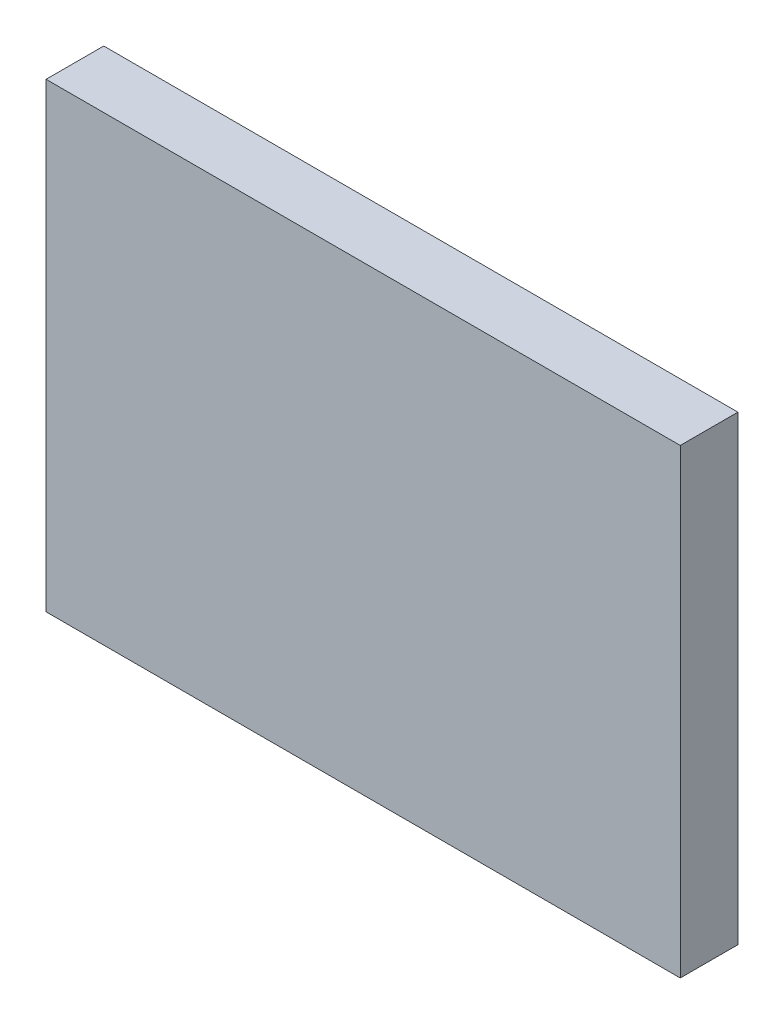
ISO-10303-21;
HEADER;
FILE_DESCRIPTION(('STEP AP214'),'2;1');
FILE_NAME('part.step','',(''),(''),'','','');
FILE_SCHEMA(('AUTOMOTIVE_DESIGN { 1 0 10303 214 1 1 1 1 }'));
ENDSEC;
DATA;
#1=APPLICATION_CONTEXT('core data for automotive mechanical design processes');
#2=APPLICATION_PROTOCOL_DEFINITION('international standard','automotive_design',2000,#1);
#3=PRODUCT_CONTEXT('',#1,'mechanical');
#4=PRODUCT('Part','Part','',(#3));
#5=PRODUCT_RELATED_PRODUCT_CATEGORY('part','',(#4));
#6=PRODUCT_DEFINITION_FORMATION('','',#4);
#7=PRODUCT_DEFINITION_CONTEXT('part definition',#1,'design');
#8=PRODUCT_DEFINITION('design','',#6,#7);
#9=PRODUCT_DEFINITION_SHAPE('','',#8);
#10=(LENGTH_UNIT() NAMED_UNIT(*) SI_UNIT(.MILLI.,.METRE.));
#11=(NAMED_UNIT(*) PLANE_ANGLE_UNIT() SI_UNIT($,.RADIAN.));
#12=(NAMED_UNIT(*) SI_UNIT($,.STERADIAN.) SOLID_ANGLE_UNIT());
#13=UNCERTAINTY_MEASURE_WITH_UNIT(LENGTH_MEASURE(1.E-05),#10,'distance_accuracy_value','');
#14=(GEOMETRIC_REPRESENTATION_CONTEXT(3) GLOBAL_UNCERTAINTY_ASSIGNED_CONTEXT((#13)) GLOBAL_UNIT_ASSIGNED_CONTEXT((#10,
#11,#12)) REPRESENTATION_CONTEXT('',''));
#15=CARTESIAN_POINT('',(0.,0.,0.));
#16=DIRECTION('',(0.,0.,1.));
#17=DIRECTION('',(1.,0.,0.));
#18=AXIS2_PLACEMENT_3D('',#15,#16,#17);
#19=CARTESIAN_POINT('',(0.,0.,6.35));
#20=DIRECTION('',(1.,0.,0.));
#21=DIRECTION('',(0.,0.,-1.));
#22=AXIS2_PLACEMENT_3D('',#19,#20,#21);
#23=PLANE('',#22);
#24=DIRECTION('',(0.,-1.,0.));
#25=VECTOR('',#24,1.);
#26=CARTESIAN_POINT('',(0.,0.,0.));
#27=LINE('',#26,#25);
#28=CARTESIAN_POINT('',(0.,50.8,0.));
#29=VERTEX_POINT('',#28);
#30=CARTESIAN_POINT('',(0.,0.,0.));
#31=VERTEX_POINT('',#30);
#32=EDGE_CURVE('E107',#29,#31,#27,.T.);
#33=ORIENTED_EDGE('',*,*,#32,.T.);
#34=DIRECTION('',(0.,0.,-1.));
#35=VECTOR('',#34,1.);
#36=CARTESIAN_POINT('',(0.,0.,6.35));
#37=LINE('',#36,#35);
#38=CARTESIAN_POINT('',(0.,0.,6.35));
#39=VERTEX_POINT('',#38);
#40=EDGE_CURVE('E11',#39,#31,#37,.T.);
#41=ORIENTED_EDGE('',*,*,#40,.F.);
#42=DIRECTION('',(0.,-1.,0.));
#43=VECTOR('',#42,1.);
#44=CARTESIAN_POINT('',(0.,0.,6.35));
#45=LINE('',#44,#43);
#46=CARTESIAN_POINT('',(0.,50.8,6.35));
#47=VERTEX_POINT('',#46);
#48=EDGE_CURVE('E91',#47,#39,#45,.T.);
#49=ORIENTED_EDGE('',*,*,#48,.F.);
#50=DIRECTION('',(0.,0.,-1.));
#51=VECTOR('',#50,1.);
#52=CARTESIAN_POINT('',(0.,50.8,6.35));
#53=LINE('',#52,#51);
#54=EDGE_CURVE('E103',#47,#29,#53,.T.);
#55=ORIENTED_EDGE('',*,*,#54,.T.);
#56=EDGE_LOOP('',(#33,#41,#49,#55));
#57=FACE_BOUND('',#56,.T.);
#58=ADVANCED_FACE('F39',(#57),#23,.F.);
#59=CARTESIAN_POINT('',(0.,0.,6.35));
#60=DIRECTION('',(0.,1.,0.));
#61=DIRECTION('',(0.,0.,1.));
#62=AXIS2_PLACEMENT_3D('',#59,#60,#61);
#63=PLANE('',#62);
#64=DIRECTION('',(1.,0.,0.));
#65=VECTOR('',#64,1.);
#66=CARTESIAN_POINT('',(0.,0.,0.));
#67=LINE('',#66,#65);
#68=CARTESIAN_POINT('',(69.85,0.,0.));
#69=VERTEX_POINT('',#68);
#70=EDGE_CURVE('E96',#31,#69,#67,.T.);
#71=ORIENTED_EDGE('',*,*,#70,.T.);
#72=DIRECTION('',(0.,0.,-1.));
#73=VECTOR('',#72,1.);
#74=CARTESIAN_POINT('',(69.85,0.,6.35));
#75=LINE('',#74,#73);
#76=CARTESIAN_POINT('',(69.85,0.,6.35));
#77=VERTEX_POINT('',#76);
#78=EDGE_CURVE('E48',#77,#69,#75,.T.);
#79=ORIENTED_EDGE('',*,*,#78,.F.);
#80=DIRECTION('',(1.,0.,0.));
#81=VECTOR('',#80,1.);
#82=CARTESIAN_POINT('',(0.,0.,6.35));
#83=LINE('',#82,#81);
#84=EDGE_CURVE('E86',#39,#77,#83,.T.);
#85=ORIENTED_EDGE('',*,*,#84,.F.);
#86=ORIENTED_EDGE('',*,*,#40,.T.);
#87=EDGE_LOOP('',(#71,#79,#85,#86));
#88=FACE_BOUND('',#87,.T.);
#89=ADVANCED_FACE('F95',(#88),#63,.F.);
#90=CARTESIAN_POINT('',(69.85,0.,6.35));
#91=DIRECTION('',(-1.,0.,0.));
#92=DIRECTION('',(0.,0.,1.));
#93=AXIS2_PLACEMENT_3D('',#90,#91,#92);
#94=PLANE('',#93);
#95=DIRECTION('',(0.,1.,0.));
#96=VECTOR('',#95,1.);
#97=CARTESIAN_POINT('',(69.85,0.,0.));
#98=LINE('',#97,#96);
#99=CARTESIAN_POINT('',(69.85,50.8,0.));
#100=VERTEX_POINT('',#99);
#101=EDGE_CURVE('E73',#69,#100,#98,.T.);
#102=ORIENTED_EDGE('',*,*,#101,.T.);
#103=DIRECTION('',(0.,0.,-1.));
#104=VECTOR('',#103,1.);
#105=CARTESIAN_POINT('',(69.85,50.8,6.35));
#106=LINE('',#105,#104);
#107=CARTESIAN_POINT('',(69.85,50.8,6.35));
#108=VERTEX_POINT('',#107);
#109=EDGE_CURVE('E98',#108,#100,#106,.T.);
#110=ORIENTED_EDGE('',*,*,#109,.F.);
#111=DIRECTION('',(0.,1.,0.));
#112=VECTOR('',#111,1.);
#113=CARTESIAN_POINT('',(69.85,0.,6.35));
#114=LINE('',#113,#112);
#115=EDGE_CURVE('E89',#77,#108,#114,.T.);
#116=ORIENTED_EDGE('',*,*,#115,.F.);
#117=ORIENTED_EDGE('',*,*,#78,.T.);
#118=EDGE_LOOP('',(#102,#110,#116,#117));
#119=FACE_BOUND('',#118,.T.);
#120=ADVANCED_FACE('F99',(#119),#94,.F.);
#121=CARTESIAN_POINT('',(0.,50.8,6.35));
#122=DIRECTION('',(0.,-1.,0.));
#123=DIRECTION('',(0.,0.,-1.));
#124=AXIS2_PLACEMENT_3D('',#121,#122,#123);
#125=PLANE('',#124);
#126=DIRECTION('',(-1.,0.,0.));
#127=VECTOR('',#126,1.);
#128=CARTESIAN_POINT('',(0.,50.8,0.));
#129=LINE('',#128,#127);
#130=EDGE_CURVE('E79',#100,#29,#129,.T.);
#131=ORIENTED_EDGE('',*,*,#130,.T.);
#132=ORIENTED_EDGE('',*,*,#54,.F.);
#133=DIRECTION('',(-1.,0.,0.));
#134=VECTOR('',#133,1.);
#135=CARTESIAN_POINT('',(0.,50.8,6.35));
#136=LINE('',#135,#134);
#137=EDGE_CURVE('E56',#108,#47,#136,.T.);
#138=ORIENTED_EDGE('',*,*,#137,.F.);
#139=ORIENTED_EDGE('',*,*,#109,.T.);
#140=EDGE_LOOP('',(#131,#132,#138,#139));
#141=FACE_BOUND('',#140,.T.);
#142=ADVANCED_FACE('F120',(#141),#125,.F.);
#143=CARTESIAN_POINT('',(0.,0.,6.35));
#144=DIRECTION('',(0.,0.,-1.));
#145=DIRECTION('',(-1.,0.,0.));
#146=AXIS2_PLACEMENT_3D('',#143,#144,#145);
#147=PLANE('',#146);
#148=ORIENTED_EDGE('',*,*,#48,.T.);
#149=ORIENTED_EDGE('',*,*,#84,.T.);
#150=ORIENTED_EDGE('',*,*,#115,.T.);
#151=ORIENTED_EDGE('',*,*,#137,.T.);
#152=EDGE_LOOP('',(#148,#149,#150,#151));
#153=FACE_BOUND('',#152,.T.);
#154=ADVANCED_FACE('F87',(#153),#147,.F.);
#155=CARTESIAN_POINT('',(0.,0.,0.));
#156=DIRECTION('',(0.,0.,-1.));
#157=DIRECTION('',(-1.,0.,0.));
#158=AXIS2_PLACEMENT_3D('',#155,#156,#157);
#159=PLANE('',#158);
#160=ORIENTED_EDGE('',*,*,#32,.F.);
#161=ORIENTED_EDGE('',*,*,#130,.F.);
#162=ORIENTED_EDGE('',*,*,#101,.F.);
#163=ORIENTED_EDGE('',*,*,#70,.F.);
#164=EDGE_LOOP('',(#160,#161,#162,#163));
#165=FACE_BOUND('',#164,.T.);
#166=ADVANCED_FACE('F123',(#165),#159,.T.);
#167=CLOSED_SHELL('',(#58,#89,#120,#142,#154,#166));
#168=MANIFOLD_SOLID_BREP('B2',#167);
#169=ADVANCED_BREP_SHAPE_REPRESENTATION('',(#18,#168),#14);
#170=SHAPE_DEFINITION_REPRESENTATION(#9,#169);
ENDSEC;
END-ISO-10303-21;
